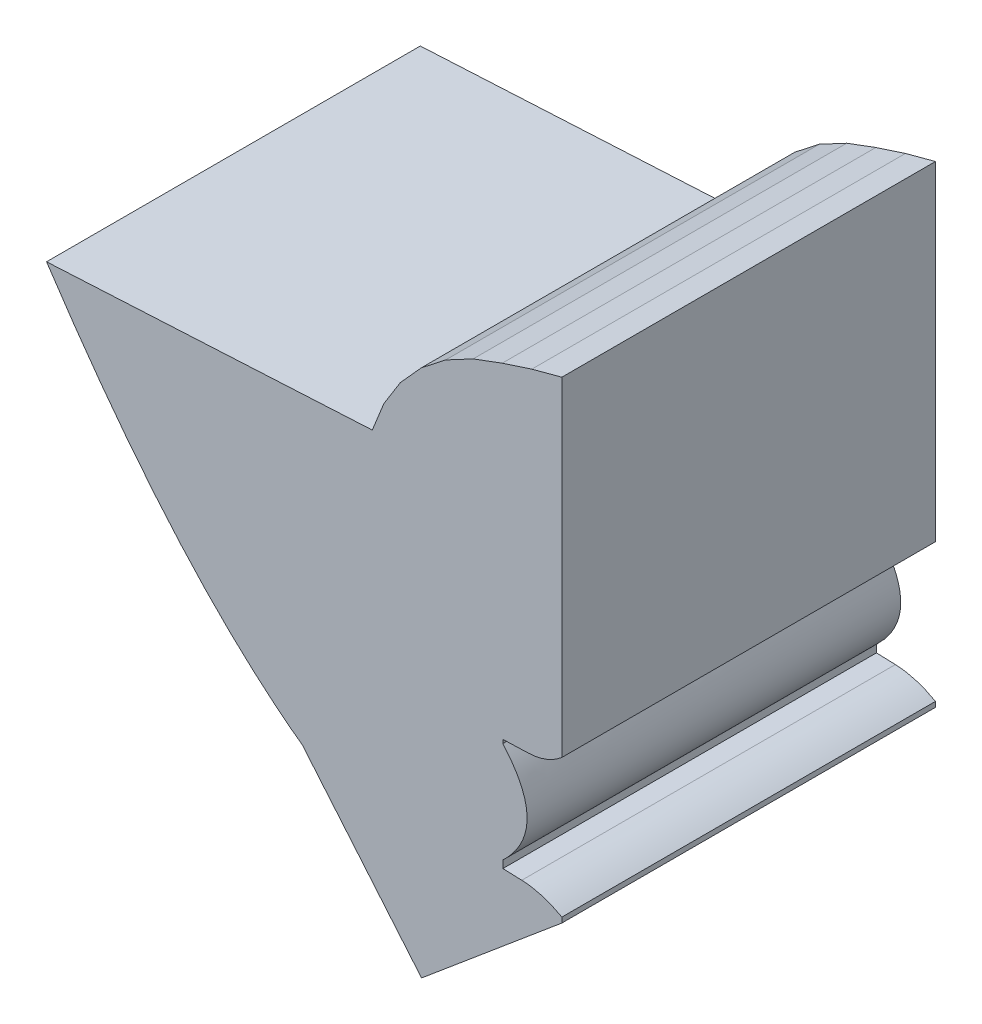
ISO-10303-21;
HEADER;
FILE_DESCRIPTION(('STEP AP214'),'2;1');
FILE_NAME('part.step','',(''),(''),'','','');
FILE_SCHEMA(('AUTOMOTIVE_DESIGN { 1 0 10303 214 1 1 1 1 }'));
ENDSEC;
DATA;
#1=APPLICATION_CONTEXT('core data for automotive mechanical design processes');
#2=APPLICATION_PROTOCOL_DEFINITION('international standard','automotive_design',2000,#1);
#3=PRODUCT_CONTEXT('',#1,'mechanical');
#4=PRODUCT('Part','Part','',(#3));
#5=PRODUCT_RELATED_PRODUCT_CATEGORY('part','',(#4));
#6=PRODUCT_DEFINITION_FORMATION('','',#4);
#7=PRODUCT_DEFINITION_CONTEXT('part definition',#1,'design');
#8=PRODUCT_DEFINITION('design','',#6,#7);
#9=PRODUCT_DEFINITION_SHAPE('','',#8);
#10=(LENGTH_UNIT() NAMED_UNIT(*) SI_UNIT(.MILLI.,.METRE.));
#11=(NAMED_UNIT(*) PLANE_ANGLE_UNIT() SI_UNIT($,.RADIAN.));
#12=(NAMED_UNIT(*) SI_UNIT($,.STERADIAN.) SOLID_ANGLE_UNIT());
#13=UNCERTAINTY_MEASURE_WITH_UNIT(LENGTH_MEASURE(1.E-05),#10,'distance_accuracy_value','');
#14=(GEOMETRIC_REPRESENTATION_CONTEXT(3) GLOBAL_UNCERTAINTY_ASSIGNED_CONTEXT((#13)) GLOBAL_UNIT_ASSIGNED_CONTEXT((#10,
#11,#12)) REPRESENTATION_CONTEXT('',''));
#15=CARTESIAN_POINT('',(0.,0.,0.));
#16=DIRECTION('',(0.,0.,1.));
#17=DIRECTION('',(1.,0.,0.));
#18=AXIS2_PLACEMENT_3D('',#15,#16,#17);
#19=CARTESIAN_POINT('',(-2.17733041778456,0.,7.21));
#20=DIRECTION('',(1.,0.,0.));
#21=DIRECTION('',(0.,1.,0.));
#22=AXIS2_PLACEMENT_3D('',#19,#20,#21);
#23=PLANE('',#22);
#24=DIRECTION('',(0.,1.,0.));
#25=VECTOR('',#24,1.);
#26=CARTESIAN_POINT('',(-2.17733041778456,0.,7.21));
#27=LINE('',#26,#25);
#28=CARTESIAN_POINT('',(-2.17733041779455,-1.68817652024789,7.21));
#29=VERTEX_POINT('',#28);
#30=CARTESIAN_POINT('',(-2.17733041778456,-1.97588987280662,7.21));
#31=VERTEX_POINT('',#30);
#32=EDGE_CURVE('E389',#29,#31,#27,.F.);
#33=ORIENTED_EDGE('',*,*,#32,.T.);
#34=DIRECTION('',(0.,0.,-1.));
#35=VECTOR('',#34,1.);
#36=CARTESIAN_POINT('',(-2.17733041778456,-1.97588987280662,7.21));
#37=LINE('',#36,#35);
#38=CARTESIAN_POINT('',(-2.17733041778456,-1.97588987280662,-7.21));
#39=VERTEX_POINT('',#38);
#40=EDGE_CURVE('E254',#31,#39,#37,.T.);
#41=ORIENTED_EDGE('',*,*,#40,.T.);
#42=DIRECTION('',(0.,1.,0.));
#43=VECTOR('',#42,1.);
#44=CARTESIAN_POINT('',(-2.17733041778456,0.,-7.21));
#45=LINE('',#44,#43);
#46=CARTESIAN_POINT('',(-2.17733041778456,-1.68817652020115,-7.21));
#47=VERTEX_POINT('',#46);
#48=EDGE_CURVE('E223',#47,#39,#45,.F.);
#49=ORIENTED_EDGE('',*,*,#48,.F.);
#50=DIRECTION('',(0.,0.,-1.));
#51=VECTOR('',#50,1.);
#52=CARTESIAN_POINT('',(-2.17733041778328,-1.68817652023794,30.8299178698776));
#53=LINE('',#52,#51);
#54=EDGE_CURVE('E536',#29,#47,#53,.T.);
#55=ORIENTED_EDGE('',*,*,#54,.F.);
#56=EDGE_LOOP('',(#33,#41,#49,#55));
#57=FACE_BOUND('',#56,.T.);
#58=ADVANCED_FACE('F60',(#57),#23,.T.);
#59=CARTESIAN_POINT('',(-82931.1005830976,996560.072871644,30.8299178698776));
#60=CARTESIAN_POINT('',(87153.8887538027,-996199.093812144,30.8299178698776));
#61=CARTESIAN_POINT('',(-91384.0928999308,995820.531871049,30.8299178698776));
#62=B_SPLINE_CURVE_WITH_KNOTS('',2,(#59,#60,#61),.UNSPECIFIED.,.F.,.F.,(3,3),(0.,1.),.UNSPECIFIED.);
#63=DIRECTION('',(0.,0.,-1.));
#64=VECTOR('',#63,1.);
#65=SURFACE_OF_LINEAR_EXTRUSION('',#62,#64);
#66=CARTESIAN_POINT('',(-10.3360060158828,-1.39847805227993,-7.21));
#67=CARTESIAN_POINT('',(-10.130177766231,-1.55526013157404,-7.21));
#68=CARTESIAN_POINT('',(-9.92505889684447,-1.70393395733359,-7.21));
#69=B_SPLINE_CURVE_WITH_KNOTS('',2,(#66,#67,#68),.UNSPECIFIED.,.F.,.F.,(3,3),(0.500919916171428,
0.500965025000237),.UNSPECIFIED.);
#70=CARTESIAN_POINT('',(-10.3360060158632,-1.39847805228234,-7.2125366176972));
#71=VERTEX_POINT('',#70);
#72=CARTESIAN_POINT('',(-9.92505889684279,-1.70393395733127,-7.21));
#73=VERTEX_POINT('',#72);
#74=EDGE_CURVE('E70',#71,#73,#69,.T.);
#75=ORIENTED_EDGE('',*,*,#74,.T.);
#76=CARTESIAN_POINT('',(-9.92303039020492,-1.70540406952979,-7.21));
#77=DIRECTION('',(0.,0.,1.));
#78=VECTOR('',#77,1.);
#79=LINE('',#76,#78);
#80=CARTESIAN_POINT('',(-9.92505890740054,-1.70393394968835,7.21));
#81=VERTEX_POINT('',#80);
#82=EDGE_CURVE('E13',#73,#81,#79,.T.);
#83=ORIENTED_EDGE('',*,*,#82,.T.);
#84=CARTESIAN_POINT('',(-9.92505890739492,-1.70393394968327,7.21));
#85=CARTESIAN_POINT('',(-10.1301777715226,-1.55526012754011,7.21));
#86=CARTESIAN_POINT('',(-10.336006015879,-1.3984780522796,7.20999999999999));
#87=B_SPLINE_CURVE_WITH_KNOTS('',2,(#84,#85,#86),.UNSPECIFIED.,.F.,.F.,(3,3),(0.500919916172588,
0.500965025000236),.UNSPECIFIED.);
#88=CARTESIAN_POINT('',(-10.3360060158816,-1.39847805227263,7.21251805157951));
#89=VERTEX_POINT('',#88);
#90=EDGE_CURVE('E381',#89,#81,#87,.F.);
#91=ORIENTED_EDGE('',*,*,#90,.F.);
#92=CARTESIAN_POINT('',(-10.336006015861,-1.39847805228632,7.21));
#93=CARTESIAN_POINT('',(-10.6228848167366,-1.17995870432205,7.21));
#94=CARTESIAN_POINT('',(-10.9111416710362,-0.945688133646021,7.21));
#95=B_SPLINE_CURVE_WITH_KNOTS('',2,(#92,#93,#94),.UNSPECIFIED.,.F.,.F.,(3,3),(0.500965025000234,
0.501027896674745),.UNSPECIFIED.);
#96=CARTESIAN_POINT('',(-10.9111416711035,-0.945688133586594,7.21251805157951));
#97=VERTEX_POINT('',#96);
#98=EDGE_CURVE('E373',#97,#89,#95,.F.);
#99=ORIENTED_EDGE('',*,*,#98,.F.);
#100=CARTESIAN_POINT('',(-10.9111416711694,-0.945688133531575,7.21));
#101=CARTESIAN_POINT('',(-15.1971813204195,2.53763911301365,7.21));
#102=CARTESIAN_POINT('',(-19.7878835648669,9.50327575735757,7.21));
#103=B_SPLINE_CURVE_WITH_KNOTS('',2,(#100,#101,#102),.UNSPECIFIED.,.F.,.F.,(3,3),
(0.501027896674761,0.501962724366634),.UNSPECIFIED.);
#104=CARTESIAN_POINT('',(-19.7878835648708,9.50327575735899,7.21251805157951));
#105=VERTEX_POINT('',#104);
#106=EDGE_CURVE('E396',#105,#97,#103,.F.);
#107=ORIENTED_EDGE('',*,*,#106,.F.);
#108=DIRECTION('',(0.,0.,1.));
#109=VECTOR('',#108,1.);
#110=CARTESIAN_POINT('',(-19.7878835648708,9.50327575735899,-7.21507323539439));
#111=LINE('',#110,#109);
#112=CARTESIAN_POINT('',(-19.7878835648708,9.50327575735899,-7.21253661769719));
#113=VERTEX_POINT('',#112);
#114=EDGE_CURVE('E305',#113,#105,#111,.T.);
#115=ORIENTED_EDGE('',*,*,#114,.F.);
#116=CARTESIAN_POINT('',(-19.7878835648714,9.50327575734023,-7.21));
#117=CARTESIAN_POINT('',(-15.197181319061,2.53763911092818,-7.21));
#118=CARTESIAN_POINT('',(-10.9111416686287,-0.945688135617351,-7.21));
#119=B_SPLINE_CURVE_WITH_KNOTS('',2,(#116,#117,#118),.UNSPECIFIED.,.F.,.F.,(3,3),
(0.501027896674483,0.501962724366634),.UNSPECIFIED.);
#120=CARTESIAN_POINT('',(-10.9111416684846,-0.945688135711886,-7.21253661769719));
#121=VERTEX_POINT('',#120);
#122=EDGE_CURVE('E308',#113,#121,#119,.T.);
#123=ORIENTED_EDGE('',*,*,#122,.T.);
#124=CARTESIAN_POINT('',(-10.9111416684921,-0.945688135713634,-7.21));
#125=CARTESIAN_POINT('',(-10.6228848154707,-1.17995870528634,-7.21));
#126=CARTESIAN_POINT('',(-10.336006015861,-1.39847805228632,-7.21));
#127=B_SPLINE_CURVE_WITH_KNOTS('',2,(#124,#125,#126),.UNSPECIFIED.,.F.,.F.,(3,3),
(0.500965025000234,0.501027896674468),.UNSPECIFIED.);
#128=EDGE_CURVE('E546',#121,#71,#127,.T.);
#129=ORIENTED_EDGE('',*,*,#128,.T.);
#130=EDGE_LOOP('',(#75,#83,#91,#99,#107,#115,#123,#129));
#131=FACE_BOUND('',#130,.T.);
#132=ADVANCED_FACE('F322',(#131),#65,.T.);
#133=DIRECTION('',(0.,1.,0.));
#134=VECTOR('',#133,1.);
#135=CARTESIAN_POINT('',(-2.17733041778456,0.,-7.21));
#136=LINE('',#135,#134);
#137=CARTESIAN_POINT('',(-2.17733041778456,2.34248700715526,-7.21));
#138=VERTEX_POINT('',#137);
#139=CARTESIAN_POINT('',(-2.17733041777607,2.20172974209443,-7.21));
#140=VERTEX_POINT('',#139);
#141=EDGE_CURVE('E362',#138,#140,#136,.F.);
#142=ORIENTED_EDGE('',*,*,#141,.F.);
#143=DIRECTION('',(0.,0.,-1.));
#144=VECTOR('',#143,1.);
#145=CARTESIAN_POINT('',(-2.17733041778456,2.34248700715526,24.0565253000013));
#146=LINE('',#145,#144);
#147=CARTESIAN_POINT('',(-2.17733041778456,2.34248700715526,7.21));
#148=VERTEX_POINT('',#147);
#149=EDGE_CURVE('E418',#148,#138,#146,.T.);
#150=ORIENTED_EDGE('',*,*,#149,.F.);
#151=DIRECTION('',(0.,1.,0.));
#152=VECTOR('',#151,1.);
#153=CARTESIAN_POINT('',(-2.17733041778456,0.,7.21));
#154=LINE('',#153,#152);
#155=CARTESIAN_POINT('',(-2.17733041778074,2.20172974210003,7.21));
#156=VERTEX_POINT('',#155);
#157=EDGE_CURVE('E372',#148,#156,#154,.F.);
#158=ORIENTED_EDGE('',*,*,#157,.T.);
#159=DIRECTION('',(0.,0.,-1.));
#160=VECTOR('',#159,1.);
#161=CARTESIAN_POINT('',(-2.17733041778074,2.20172974210003,30.8299178698776));
#162=LINE('',#161,#160);
#163=EDGE_CURVE('E532',#156,#140,#162,.T.);
#164=ORIENTED_EDGE('',*,*,#163,.T.);
#165=EDGE_LOOP('',(#142,#150,#158,#164));
#166=FACE_BOUND('',#165,.T.);
#167=ADVANCED_FACE('F330',(#166),#23,.T.);
#168=CARTESIAN_POINT('',(0.,0.,7.21));
#169=DIRECTION('',(0.,0.,1.));
#170=DIRECTION('',(1.,0.,0.));
#171=AXIS2_PLACEMENT_3D('',#168,#169,#170);
#172=PLANE('',#171);
#173=ORIENTED_EDGE('',*,*,#90,.T.);
#174=DIRECTION('',(0.642787609686544,-0.766044443118975,0.));
#175=VECTOR('',#174,1.);
#176=CARTESIAN_POINT('',(-9.92906628699395,-1.70519329135708,7.21));
#177=LINE('',#176,#175);
#178=CARTESIAN_POINT('',(-5.31573259697203,-7.20315029027654,7.21));
#179=VERTEX_POINT('',#178);
#180=EDGE_CURVE('E73',#81,#179,#177,.T.);
#181=ORIENTED_EDGE('',*,*,#180,.T.);
#182=DIRECTION('',(0.766044443120674,0.642787609684519,0.));
#183=VECTOR('',#182,1.);
#184=CARTESIAN_POINT('',(0.100000000004221,-2.65881106562334,7.21));
#185=LINE('',#184,#183);
#186=CARTESIAN_POINT('',(0.100000000004221,-2.65881106562334,7.21));
#187=VERTEX_POINT('',#186);
#188=EDGE_CURVE('E249',#179,#187,#185,.T.);
#189=ORIENTED_EDGE('',*,*,#188,.T.);
#190=DIRECTION('',(-1.62011653008151E-11,1.,0.));
#191=VECTOR('',#190,1.);
#192=CARTESIAN_POINT('',(0.100000000000981,-2.45881106562334,7.21));
#193=LINE('',#192,#191);
#194=CARTESIAN_POINT('',(0.100000000000981,-2.45881106562334,7.21));
#195=VERTEX_POINT('',#194);
#196=EDGE_CURVE('E258',#187,#195,#193,.T.);
#197=ORIENTED_EDGE('',*,*,#196,.T.);
#198=CARTESIAN_POINT('',(-15004.7897636461,-999892.444646946,7.21));
#199=CARTESIAN_POINT('',(17450.906437277,999845.695156391,7.21));
#200=CARTESIAN_POINT('',(-19903.023110908,-999806.945665836,7.21));
#201=B_SPLINE_CURVE_WITH_KNOTS('',2,(#198,#199,#200),.UNSPECIFIED.,.F.,.F.,(3,3),(0.,1.),.UNSPECIFIED.);
#202=CARTESIAN_POINT('',(-1.44765075676889,-2.00137084805176,7.21));
#203=VERTEX_POINT('',#202);
#204=EDGE_CURVE('E253',#195,#203,#201,.T.);
#205=ORIENTED_EDGE('',*,*,#204,.T.);
#206=DIRECTION('',(-0.999390827019096,0.0348994967024967,0.));
#207=VECTOR('',#206,1.);
#208=CARTESIAN_POINT('',(-1.44765075676889,-2.00137084805176,7.21));
#209=LINE('',#208,#207);
#210=EDGE_CURVE('E235',#203,#31,#209,.T.);
#211=ORIENTED_EDGE('',*,*,#210,.T.);
#212=ORIENTED_EDGE('',*,*,#32,.F.);
#213=CARTESIAN_POINT('',(-2.17733041777607,2.20172974209443,7.21));
#214=CARTESIAN_POINT('',(-0.307419303310444,0.0931805865995528,7.21));
#215=CARTESIAN_POINT('',(-2.17733041779435,-1.68817652026,7.21));
#216=B_SPLINE_CURVE_WITH_KNOTS('',2,(#213,#214,#215),.UNSPECIFIED.,.F.,.F.,(3,3),
(0.49947186766891,0.500440643667569),.UNSPECIFIED.);
#217=EDGE_CURVE('E534',#156,#29,#216,.T.);
#218=ORIENTED_EDGE('',*,*,#217,.F.);
#219=ORIENTED_EDGE('',*,*,#157,.F.);
#220=DIRECTION('',(0.999390827019096,0.0348994967025048,0.));
#221=VECTOR('',#220,1.);
#222=CARTESIAN_POINT('',(-2.17733041778456,2.34248700715526,7.21));
#223=LINE('',#222,#221);
#224=CARTESIAN_POINT('',(-1.19050164048462,2.37694782742692,7.21000000000002));
#225=VERTEX_POINT('',#224);
#226=EDGE_CURVE('E81',#148,#225,#223,.T.);
#227=ORIENTED_EDGE('',*,*,#226,.T.);
#228=CARTESIAN_POINT('',(-343900.072311573,939011.080499257,7.21000000000001));
#229=CARTESIAN_POINT('',(342019.599581338,-939690.120785908,7.21000000000001));
#230=CARTESIAN_POINT('',(-340141.301828429,940379.16107256,7.21000000000001));
#231=B_SPLINE_CURVE_WITH_KNOTS('',2,(#228,#229,#230),.UNSPECIFIED.,.F.,.F.,(3,3),(0.,1.),.UNSPECIFIED.);
#232=CARTESIAN_POINT('',(0.100000000004221,2.87767341815847,7.21000000000001));
#233=VERTEX_POINT('',#232);
#234=EDGE_CURVE('E383',#225,#233,#231,.T.);
#235=ORIENTED_EDGE('',*,*,#234,.T.);
#236=DIRECTION('',(0.,1.,0.));
#237=VECTOR('',#236,1.);
#238=CARTESIAN_POINT('',(0.100000000004221,2.87767341815847,7.21));
#239=LINE('',#238,#237);
#240=CARTESIAN_POINT('',(0.100000000004747,15.587903347272,7.21));
#241=VERTEX_POINT('',#240);
#242=EDGE_CURVE('E426',#233,#241,#239,.T.);
#243=ORIENTED_EDGE('',*,*,#242,.T.);
#244=DIRECTION('',(-0.96592582628907,-0.258819045102515,0.));
#245=VECTOR('',#244,1.);
#246=CARTESIAN_POINT('',(-1.05911099154214,15.277320493149,7.21));
#247=LINE('',#246,#245);
#248=CARTESIAN_POINT('',(-1.05911099154214,15.277320493149,7.21000000000001));
#249=VERTEX_POINT('',#248);
#250=EDGE_CURVE('E433',#241,#249,#247,.T.);
#251=ORIENTED_EDGE('',*,*,#250,.T.);
#252=DIRECTION('',(-0.951056516295155,-0.309016994374943,0.));
#253=VECTOR('',#252,1.);
#254=CARTESIAN_POINT('',(-2.20037881109632,14.906500099899,7.21));
#255=LINE('',#254,#253);
#256=CARTESIAN_POINT('',(-2.20037881109632,14.906500099899,7.21000000000001));
#257=VERTEX_POINT('',#256);
#258=EDGE_CURVE('E440',#249,#257,#255,.T.);
#259=ORIENTED_EDGE('',*,*,#258,.T.);
#260=DIRECTION('',(-0.9366721892484,-0.350207381259461,0.));
#261=VECTOR('',#260,1.);
#262=CARTESIAN_POINT('',(-3.3243854381944,14.4862512423877,7.21));
#263=LINE('',#262,#261);
#264=CARTESIAN_POINT('',(-3.3243854381944,14.4862512423877,7.21000000000001));
#265=VERTEX_POINT('',#264);
#266=EDGE_CURVE('E509',#257,#265,#263,.T.);
#267=ORIENTED_EDGE('',*,*,#266,.T.);
#268=DIRECTION('',(-0.882947592859007,-0.46947156278574,0.));
#269=VECTOR('',#268,1.);
#270=CARTESIAN_POINT('',(-4.38392254962521,13.9228853670448,7.21));
#271=LINE('',#270,#269);
#272=CARTESIAN_POINT('',(-4.38392254962521,13.9228853670448,7.21000000000001));
#273=VERTEX_POINT('',#272);
#274=EDGE_CURVE('E510',#265,#273,#271,.T.);
#275=ORIENTED_EDGE('',*,*,#274,.T.);
#276=DIRECTION('',(-0.788010753606726,-0.615661475325654,0.));
#277=VECTOR('',#276,1.);
#278=CARTESIAN_POINT('',(-5.32953545395328,13.184091596654,7.21));
#279=LINE('',#278,#277);
#280=CARTESIAN_POINT('',(-5.32953545395328,13.184091596654,7.21000000000001));
#281=VERTEX_POINT('',#280);
#282=EDGE_CURVE('E502',#273,#281,#279,.T.);
#283=ORIENTED_EDGE('',*,*,#282,.T.);
#284=DIRECTION('',(-0.669130606358526,-0.743144825477694,0.));
#285=VECTOR('',#284,1.);
#286=CARTESIAN_POINT('',(-6.13249218158351,12.2923178060808,7.21));
#287=LINE('',#286,#285);
#288=CARTESIAN_POINT('',(-6.13249218158351,12.2923178060808,7.21000000000001));
#289=VERTEX_POINT('',#288);
#290=EDGE_CURVE('E505',#281,#289,#287,.T.);
#291=ORIENTED_EDGE('',*,*,#290,.T.);
#292=DIRECTION('',(-0.52991926423321,-0.848048096156423,0.));
#293=VECTOR('',#292,1.);
#294=CARTESIAN_POINT('',(-6.76839529866336,11.2746600906931,7.21));
#295=LINE('',#294,#293);
#296=CARTESIAN_POINT('',(-6.76839529866336,11.2746600906931,7.21000000000001));
#297=VERTEX_POINT('',#296);
#298=EDGE_CURVE('E458',#289,#297,#295,.T.);
#299=ORIENTED_EDGE('',*,*,#298,.T.);
#300=DIRECTION('',(-0.374606593415918,-0.927183854566785,0.));
#301=VECTOR('',#300,1.);
#302=CARTESIAN_POINT('',(-7.21792321076246,10.1620394652129,7.21));
#303=LINE('',#302,#301);
#304=CARTESIAN_POINT('',(-7.21792321076246,10.1620394652129,7.21000000000001));
#305=VERTEX_POINT('',#304);
#306=EDGE_CURVE('E407',#297,#305,#303,.T.);
#307=ORIENTED_EDGE('',*,*,#306,.T.);
#308=DIRECTION('',(-0.998629534754494,-0.0523359562444688,0.));
#309=VECTOR('',#308,1.);
#310=CARTESIAN_POINT('',(-10.3098203952063,10.,7.21));
#311=LINE('',#310,#309);
#312=EDGE_CURVE('E382',#305,#105,#311,.T.);
#313=ORIENTED_EDGE('',*,*,#312,.T.);
#314=ORIENTED_EDGE('',*,*,#106,.T.);
#315=ORIENTED_EDGE('',*,*,#98,.T.);
#316=EDGE_LOOP('',(#173,#181,#189,#197,#205,#211,#212,#218,#219,#227,#235,#243,#251,#259,#267,
#275,#283,#291,#299,#307,#313,#314,#315));
#317=FACE_BOUND('',#316,.T.);
#318=ADVANCED_FACE('F403',(#317),#172,.T.);
#319=CARTESIAN_POINT('',(0.,0.,-7.21));
#320=DIRECTION('',(0.,0.,1.));
#321=DIRECTION('',(1.,0.,0.));
#322=AXIS2_PLACEMENT_3D('',#319,#320,#321);
#323=PLANE('',#322);
#324=ORIENTED_EDGE('',*,*,#48,.T.);
#325=DIRECTION('',(0.999390827019096,-0.0348994967024967,0.));
#326=VECTOR('',#325,1.);
#327=CARTESIAN_POINT('',(-1.44765075676889,-2.00137084805176,-7.21));
#328=LINE('',#327,#326);
#329=CARTESIAN_POINT('',(-1.44765075676889,-2.00137084805176,-7.21));
#330=VERTEX_POINT('',#329);
#331=EDGE_CURVE('E215',#39,#330,#328,.T.);
#332=ORIENTED_EDGE('',*,*,#331,.T.);
#333=CARTESIAN_POINT('',(-15004.7897636461,-999892.444646946,-7.21));
#334=CARTESIAN_POINT('',(17450.906437277,999845.695156391,-7.21));
#335=CARTESIAN_POINT('',(-19903.023110908,-999806.945665836,-7.21));
#336=B_SPLINE_CURVE_WITH_KNOTS('',2,(#333,#334,#335),.UNSPECIFIED.,.F.,.F.,(3,3),(0.,1.),.UNSPECIFIED.);
#337=CARTESIAN_POINT('',(0.100000000000981,-2.45881106562334,-7.21));
#338=VERTEX_POINT('',#337);
#339=EDGE_CURVE('E219',#330,#338,#336,.F.);
#340=ORIENTED_EDGE('',*,*,#339,.T.);
#341=DIRECTION('',(1.62011653008151E-11,-1.,0.));
#342=VECTOR('',#341,1.);
#343=CARTESIAN_POINT('',(0.100000000000981,-2.45881106562334,-7.21));
#344=LINE('',#343,#342);
#345=CARTESIAN_POINT('',(0.100000000004221,-2.65881106562334,-7.21));
#346=VERTEX_POINT('',#345);
#347=EDGE_CURVE('E237',#338,#346,#344,.T.);
#348=ORIENTED_EDGE('',*,*,#347,.T.);
#349=DIRECTION('',(-0.766044443120674,-0.642787609684519,0.));
#350=VECTOR('',#349,1.);
#351=CARTESIAN_POINT('',(0.100000000004221,-2.65881106562334,-7.21));
#352=LINE('',#351,#350);
#353=CARTESIAN_POINT('',(-5.31573259697203,-7.20315029027654,-7.21));
#354=VERTEX_POINT('',#353);
#355=EDGE_CURVE('E241',#346,#354,#352,.T.);
#356=ORIENTED_EDGE('',*,*,#355,.T.);
#357=DIRECTION('',(-0.642787609686544,0.766044443118975,0.));
#358=VECTOR('',#357,1.);
#359=CARTESIAN_POINT('',(-9.92906628699395,-1.70519329135708,-7.21));
#360=LINE('',#359,#358);
#361=EDGE_CURVE('E271',#354,#73,#360,.T.);
#362=ORIENTED_EDGE('',*,*,#361,.T.);
#363=ORIENTED_EDGE('',*,*,#74,.F.);
#364=ORIENTED_EDGE('',*,*,#128,.F.);
#365=ORIENTED_EDGE('',*,*,#122,.F.);
#366=DIRECTION('',(-0.998629534754494,-0.0523359562444688,0.));
#367=VECTOR('',#366,1.);
#368=CARTESIAN_POINT('',(-0.550881453784725,10.5114443180936,-7.21));
#369=LINE('',#368,#367);
#370=CARTESIAN_POINT('',(-7.21792321076246,10.1620394652129,-7.21));
#371=VERTEX_POINT('',#370);
#372=EDGE_CURVE('E405',#371,#113,#369,.T.);
#373=ORIENTED_EDGE('',*,*,#372,.F.);
#374=DIRECTION('',(0.374606593415918,0.927183854566785,0.));
#375=VECTOR('',#374,1.);
#376=CARTESIAN_POINT('',(-7.21792321076246,10.1620394652129,-7.21));
#377=LINE('',#376,#375);
#378=CARTESIAN_POINT('',(-6.76839529866336,11.2746600906931,-7.21));
#379=VERTEX_POINT('',#378);
#380=EDGE_CURVE('E420',#371,#379,#377,.T.);
#381=ORIENTED_EDGE('',*,*,#380,.T.);
#382=DIRECTION('',(0.52991926423321,0.848048096156423,0.));
#383=VECTOR('',#382,1.);
#384=CARTESIAN_POINT('',(-6.76839529866336,11.2746600906931,-7.21));
#385=LINE('',#384,#383);
#386=CARTESIAN_POINT('',(-6.13249218158351,12.2923178060808,-7.21));
#387=VERTEX_POINT('',#386);
#388=EDGE_CURVE('E455',#379,#387,#385,.T.);
#389=ORIENTED_EDGE('',*,*,#388,.T.);
#390=DIRECTION('',(0.669130606358526,0.743144825477694,0.));
#391=VECTOR('',#390,1.);
#392=CARTESIAN_POINT('',(-6.13249218158351,12.2923178060808,-7.21));
#393=LINE('',#392,#391);
#394=CARTESIAN_POINT('',(-5.32953545395328,13.184091596654,-7.21));
#395=VERTEX_POINT('',#394);
#396=EDGE_CURVE('E462',#387,#395,#393,.T.);
#397=ORIENTED_EDGE('',*,*,#396,.T.);
#398=DIRECTION('',(0.788010753606726,0.615661475325654,0.));
#399=VECTOR('',#398,1.);
#400=CARTESIAN_POINT('',(-5.32953545395328,13.184091596654,-7.21));
#401=LINE('',#400,#399);
#402=CARTESIAN_POINT('',(-4.38392254962521,13.9228853670448,-7.21));
#403=VERTEX_POINT('',#402);
#404=EDGE_CURVE('E470',#395,#403,#401,.T.);
#405=ORIENTED_EDGE('',*,*,#404,.T.);
#406=DIRECTION('',(0.882947592859007,0.46947156278574,0.));
#407=VECTOR('',#406,1.);
#408=CARTESIAN_POINT('',(-4.38392254962521,13.9228853670448,-7.21));
#409=LINE('',#408,#407);
#410=CARTESIAN_POINT('',(-3.3243854381944,14.4862512423877,-7.21));
#411=VERTEX_POINT('',#410);
#412=EDGE_CURVE('E469',#403,#411,#409,.T.);
#413=ORIENTED_EDGE('',*,*,#412,.T.);
#414=DIRECTION('',(0.9366721892484,0.350207381259461,0.));
#415=VECTOR('',#414,1.);
#416=CARTESIAN_POINT('',(-3.3243854381944,14.4862512423877,-7.21));
#417=LINE('',#416,#415);
#418=CARTESIAN_POINT('',(-2.20037881109632,14.906500099899,-7.21000000000001));
#419=VERTEX_POINT('',#418);
#420=EDGE_CURVE('E641',#411,#419,#417,.T.);
#421=ORIENTED_EDGE('',*,*,#420,.T.);
#422=DIRECTION('',(0.951056516295155,0.309016994374943,0.));
#423=VECTOR('',#422,1.);
#424=CARTESIAN_POINT('',(-2.20037881109632,14.906500099899,-7.21));
#425=LINE('',#424,#423);
#426=CARTESIAN_POINT('',(-1.05911099154214,15.277320493149,-7.21));
#427=VERTEX_POINT('',#426);
#428=EDGE_CURVE('E489',#419,#427,#425,.T.);
#429=ORIENTED_EDGE('',*,*,#428,.T.);
#430=DIRECTION('',(0.96592582628907,0.258819045102515,0.));
#431=VECTOR('',#430,1.);
#432=CARTESIAN_POINT('',(-1.05911099154214,15.277320493149,-7.21));
#433=LINE('',#432,#431);
#434=CARTESIAN_POINT('',(0.100000000004747,15.587903347272,-7.21));
#435=VERTEX_POINT('',#434);
#436=EDGE_CURVE('E487',#427,#435,#433,.T.);
#437=ORIENTED_EDGE('',*,*,#436,.T.);
#438=DIRECTION('',(0.,-1.,0.));
#439=VECTOR('',#438,1.);
#440=CARTESIAN_POINT('',(0.100000000004221,2.87767341815847,-7.21));
#441=LINE('',#440,#439);
#442=CARTESIAN_POINT('',(0.0999999999995449,2.8776734181557,-7.21000000000001));
#443=VERTEX_POINT('',#442);
#444=EDGE_CURVE('E485',#435,#443,#441,.T.);
#445=ORIENTED_EDGE('',*,*,#444,.T.);
#446=CARTESIAN_POINT('',(-343900.072311573,939011.080499257,-7.21000000000001));
#447=CARTESIAN_POINT('',(342019.599581338,-939690.120785908,-7.21000000000001));
#448=CARTESIAN_POINT('',(-340141.301828429,940379.16107256,-7.21000000000001));
#449=B_SPLINE_CURVE_WITH_KNOTS('',2,(#446,#447,#448),.UNSPECIFIED.,.F.,.F.,(3,3),(0.,1.),.UNSPECIFIED.);
#450=CARTESIAN_POINT('',(-1.19050164048462,2.37694782741517,-7.21));
#451=VERTEX_POINT('',#450);
#452=EDGE_CURVE('E480',#443,#451,#449,.F.);
#453=ORIENTED_EDGE('',*,*,#452,.T.);
#454=DIRECTION('',(-0.999390827019096,-0.0348994967025048,0.));
#455=VECTOR('',#454,1.);
#456=CARTESIAN_POINT('',(-2.17733041778456,2.34248700715526,-7.21));
#457=LINE('',#456,#455);
#458=EDGE_CURVE('E473',#451,#138,#457,.T.);
#459=ORIENTED_EDGE('',*,*,#458,.T.);
#460=ORIENTED_EDGE('',*,*,#141,.T.);
#461=CARTESIAN_POINT('',(-2.17733041776379,-1.68817652023098,-7.21));
#462=CARTESIAN_POINT('',(-0.307419303328964,0.0931805866132554,-7.21));
#463=CARTESIAN_POINT('',(-2.17733041776824,2.20172974208621,-7.21));
#464=B_SPLINE_CURVE_WITH_KNOTS('',2,(#461,#462,#463),.UNSPECIFIED.,.F.,.F.,(3,3),
(0.499471867668912,0.500440643667561),.UNSPECIFIED.);
#465=EDGE_CURVE('E310',#47,#140,#464,.T.);
#466=ORIENTED_EDGE('',*,*,#465,.F.);
#467=EDGE_LOOP('',(#324,#332,#340,#348,#356,#362,#363,#364,#365,#373,#381,#389,#397,#405,#413,
#421,#429,#437,#445,#453,#459,#460,#466));
#468=FACE_BOUND('',#467,.T.);
#469=ADVANCED_FACE('F220',(#468),#323,.F.);
#470=CARTESIAN_POINT('',(-996021.636606251,89148.1321438377,30.8299178698776));
#471=CARTESIAN_POINT('',(996193.448091746,-87155.7427476542,30.8299178698776));
#472=CARTESIAN_POINT('',(-996370.259577241,85163.3533514707,30.8299178698776));
#473=B_SPLINE_CURVE_WITH_KNOTS('',2,(#470,#471,#472),.UNSPECIFIED.,.F.,.F.,(3,3),(0.,1.),.UNSPECIFIED.);
#474=DIRECTION('',(0.,0.,-1.));
#475=VECTOR('',#474,1.);
#476=SURFACE_OF_LINEAR_EXTRUSION('',#473,#475);
#477=ORIENTED_EDGE('',*,*,#163,.F.);
#478=ORIENTED_EDGE('',*,*,#217,.T.);
#479=ORIENTED_EDGE('',*,*,#54,.T.);
#480=ORIENTED_EDGE('',*,*,#465,.T.);
#481=EDGE_LOOP('',(#477,#478,#479,#480));
#482=FACE_BOUND('',#481,.T.);
#483=ADVANCED_FACE('F331',(#482),#476,.T.);
#484=CARTESIAN_POINT('',(-19.7878835648708,9.50327575735899,-7.21507323539439));
#485=DIRECTION('',(-0.0523359562444688,0.998629534754494,0.));
#486=DIRECTION('',(-0.998629534754494,-0.0523359562444688,0.));
#487=AXIS2_PLACEMENT_3D('',#484,#485,#486);
#488=PLANE('',#487);
#489=ORIENTED_EDGE('',*,*,#312,.F.);
#490=DIRECTION('',(0.,0.,-1.));
#491=VECTOR('',#490,1.);
#492=CARTESIAN_POINT('',(-7.21792321076246,10.1620394652129,24.0565253000013));
#493=LINE('',#492,#491);
#494=EDGE_CURVE('E413',#305,#371,#493,.T.);
#495=ORIENTED_EDGE('',*,*,#494,.T.);
#496=ORIENTED_EDGE('',*,*,#372,.T.);
#497=ORIENTED_EDGE('',*,*,#114,.T.);
#498=EDGE_LOOP('',(#489,#495,#496,#497));
#499=FACE_BOUND('',#498,.T.);
#500=ADVANCED_FACE('F327',(#499),#488,.T.);
#501=CARTESIAN_POINT('',(-1.05911099154214,15.277320493149,24.0565253000013));
#502=DIRECTION('',(0.258819045102515,-0.96592582628907,0.));
#503=DIRECTION('',(0.96592582628907,0.258819045102515,0.));
#504=AXIS2_PLACEMENT_3D('',#501,#502,#503);
#505=PLANE('',#504);
#506=ORIENTED_EDGE('',*,*,#250,.F.);
#507=DIRECTION('',(0.,0.,-1.));
#508=VECTOR('',#507,1.);
#509=CARTESIAN_POINT('',(0.100000000004747,15.587903347272,24.0565253000013));
#510=LINE('',#509,#508);
#511=EDGE_CURVE('E297',#241,#435,#510,.T.);
#512=ORIENTED_EDGE('',*,*,#511,.T.);
#513=ORIENTED_EDGE('',*,*,#436,.F.);
#514=DIRECTION('',(0.,0.,-1.));
#515=VECTOR('',#514,1.);
#516=CARTESIAN_POINT('',(-1.05911099154214,15.277320493149,24.0565253000013));
#517=LINE('',#516,#515);
#518=EDGE_CURVE('E441',#249,#427,#517,.T.);
#519=ORIENTED_EDGE('',*,*,#518,.F.);
#520=EDGE_LOOP('',(#506,#512,#513,#519));
#521=FACE_BOUND('',#520,.T.);
#522=ADVANCED_FACE('F523',(#521),#505,.F.);
#523=CARTESIAN_POINT('',(-2.20037881109632,14.906500099899,24.0565253000013));
#524=DIRECTION('',(0.309016994374943,-0.951056516295155,0.));
#525=DIRECTION('',(0.951056516295155,0.309016994374943,0.));
#526=AXIS2_PLACEMENT_3D('',#523,#524,#525);
#527=PLANE('',#526);
#528=ORIENTED_EDGE('',*,*,#258,.F.);
#529=ORIENTED_EDGE('',*,*,#518,.T.);
#530=ORIENTED_EDGE('',*,*,#428,.F.);
#531=DIRECTION('',(0.,0.,-1.));
#532=VECTOR('',#531,1.);
#533=CARTESIAN_POINT('',(-2.20037881109632,14.906500099899,24.0565253000013));
#534=LINE('',#533,#532);
#535=EDGE_CURVE('E442',#257,#419,#534,.T.);
#536=ORIENTED_EDGE('',*,*,#535,.F.);
#537=EDGE_LOOP('',(#528,#529,#530,#536));
#538=FACE_BOUND('',#537,.T.);
#539=ADVANCED_FACE('F517',(#538),#527,.F.);
#540=CARTESIAN_POINT('',(-3.3243854381944,14.4862512423877,24.0565253000013));
#541=DIRECTION('',(0.350207381259461,-0.9366721892484,0.));
#542=DIRECTION('',(0.9366721892484,0.350207381259461,0.));
#543=AXIS2_PLACEMENT_3D('',#540,#541,#542);
#544=PLANE('',#543);
#545=ORIENTED_EDGE('',*,*,#266,.F.);
#546=ORIENTED_EDGE('',*,*,#535,.T.);
#547=ORIENTED_EDGE('',*,*,#420,.F.);
#548=DIRECTION('',(0.,0.,-1.));
#549=VECTOR('',#548,1.);
#550=CARTESIAN_POINT('',(-3.3243854381944,14.4862512423877,24.0565253000013));
#551=LINE('',#550,#549);
#552=EDGE_CURVE('E444',#265,#411,#551,.T.);
#553=ORIENTED_EDGE('',*,*,#552,.F.);
#554=EDGE_LOOP('',(#545,#546,#547,#553));
#555=FACE_BOUND('',#554,.T.);
#556=ADVANCED_FACE('F701',(#555),#544,.F.);
#557=CARTESIAN_POINT('',(-4.38392254962521,13.9228853670448,24.0565253000013));
#558=DIRECTION('',(0.46947156278574,-0.882947592859007,0.));
#559=DIRECTION('',(0.882947592859007,0.46947156278574,0.));
#560=AXIS2_PLACEMENT_3D('',#557,#558,#559);
#561=PLANE('',#560);
#562=ORIENTED_EDGE('',*,*,#274,.F.);
#563=ORIENTED_EDGE('',*,*,#552,.T.);
#564=ORIENTED_EDGE('',*,*,#412,.F.);
#565=DIRECTION('',(0.,0.,-1.));
#566=VECTOR('',#565,1.);
#567=CARTESIAN_POINT('',(-4.38392254962521,13.9228853670448,24.0565253000013));
#568=LINE('',#567,#566);
#569=EDGE_CURVE('E450',#273,#403,#568,.T.);
#570=ORIENTED_EDGE('',*,*,#569,.F.);
#571=EDGE_LOOP('',(#562,#563,#564,#570));
#572=FACE_BOUND('',#571,.T.);
#573=ADVANCED_FACE('F706',(#572),#561,.F.);
#574=CARTESIAN_POINT('',(-5.32953545395328,13.184091596654,24.0565253000013));
#575=DIRECTION('',(0.615661475325654,-0.788010753606726,0.));
#576=DIRECTION('',(0.788010753606726,0.615661475325654,0.));
#577=AXIS2_PLACEMENT_3D('',#574,#575,#576);
#578=PLANE('',#577);
#579=ORIENTED_EDGE('',*,*,#282,.F.);
#580=ORIENTED_EDGE('',*,*,#569,.T.);
#581=ORIENTED_EDGE('',*,*,#404,.F.);
#582=DIRECTION('',(0.,0.,-1.));
#583=VECTOR('',#582,1.);
#584=CARTESIAN_POINT('',(-5.32953545395328,13.184091596654,24.0565253000013));
#585=LINE('',#584,#583);
#586=EDGE_CURVE('E446',#281,#395,#585,.T.);
#587=ORIENTED_EDGE('',*,*,#586,.F.);
#588=EDGE_LOOP('',(#579,#580,#581,#587));
#589=FACE_BOUND('',#588,.T.);
#590=ADVANCED_FACE('F716',(#589),#578,.F.);
#591=CARTESIAN_POINT('',(-6.13249218158351,12.2923178060808,24.0565253000013));
#592=DIRECTION('',(0.743144825477693,-0.669130606358526,0.));
#593=DIRECTION('',(0.669130606358526,0.743144825477694,0.));
#594=AXIS2_PLACEMENT_3D('',#591,#592,#593);
#595=PLANE('',#594);
#596=ORIENTED_EDGE('',*,*,#290,.F.);
#597=ORIENTED_EDGE('',*,*,#586,.T.);
#598=ORIENTED_EDGE('',*,*,#396,.F.);
#599=DIRECTION('',(0.,0.,-1.));
#600=VECTOR('',#599,1.);
#601=CARTESIAN_POINT('',(-6.13249218158351,12.2923178060808,24.0565253000013));
#602=LINE('',#601,#600);
#603=EDGE_CURVE('E421',#289,#387,#602,.T.);
#604=ORIENTED_EDGE('',*,*,#603,.F.);
#605=EDGE_LOOP('',(#596,#597,#598,#604));
#606=FACE_BOUND('',#605,.T.);
#607=ADVANCED_FACE('F465',(#606),#595,.F.);
#608=CARTESIAN_POINT('',(-6.76839529866336,11.2746600906931,24.0565253000013));
#609=DIRECTION('',(0.848048096156423,-0.52991926423321,0.));
#610=DIRECTION('',(0.52991926423321,0.848048096156423,0.));
#611=AXIS2_PLACEMENT_3D('',#608,#609,#610);
#612=PLANE('',#611);
#613=ORIENTED_EDGE('',*,*,#298,.F.);
#614=ORIENTED_EDGE('',*,*,#603,.T.);
#615=ORIENTED_EDGE('',*,*,#388,.F.);
#616=DIRECTION('',(0.,0.,-1.));
#617=VECTOR('',#616,1.);
#618=CARTESIAN_POINT('',(-6.76839529866336,11.2746600906931,24.0565253000013));
#619=LINE('',#618,#617);
#620=EDGE_CURVE('E417',#297,#379,#619,.T.);
#621=ORIENTED_EDGE('',*,*,#620,.F.);
#622=EDGE_LOOP('',(#613,#614,#615,#621));
#623=FACE_BOUND('',#622,.T.);
#624=ADVANCED_FACE('F453',(#623),#612,.F.);
#625=CARTESIAN_POINT('',(-7.21792321076246,10.1620394652129,24.0565253000013));
#626=DIRECTION('',(0.927183854566785,-0.374606593415918,0.));
#627=DIRECTION('',(0.374606593415918,0.927183854566785,0.));
#628=AXIS2_PLACEMENT_3D('',#625,#626,#627);
#629=PLANE('',#628);
#630=ORIENTED_EDGE('',*,*,#306,.F.);
#631=ORIENTED_EDGE('',*,*,#620,.T.);
#632=ORIENTED_EDGE('',*,*,#380,.F.);
#633=ORIENTED_EDGE('',*,*,#494,.F.);
#634=EDGE_LOOP('',(#630,#631,#632,#633));
#635=FACE_BOUND('',#634,.T.);
#636=ADVANCED_FACE('F412',(#635),#629,.F.);
#637=CARTESIAN_POINT('',(-2.17733041778456,2.34248700715526,24.0565253000013));
#638=DIRECTION('',(-0.0348994967025048,0.999390827019096,0.));
#639=DIRECTION('',(-0.999390827019096,-0.0348994967025048,0.));
#640=AXIS2_PLACEMENT_3D('',#637,#638,#639);
#641=PLANE('',#640);
#642=ORIENTED_EDGE('',*,*,#226,.F.);
#643=ORIENTED_EDGE('',*,*,#149,.T.);
#644=ORIENTED_EDGE('',*,*,#458,.F.);
#645=DIRECTION('',(0.,0.,-1.));
#646=VECTOR('',#645,1.);
#647=CARTESIAN_POINT('',(-1.19050164048462,2.37694782742692,24.0565253000013));
#648=LINE('',#647,#646);
#649=EDGE_CURVE('E423',#225,#451,#648,.T.);
#650=ORIENTED_EDGE('',*,*,#649,.F.);
#651=EDGE_LOOP('',(#642,#643,#644,#650));
#652=FACE_BOUND('',#651,.T.);
#653=ADVANCED_FACE('F292',(#652),#641,.F.);
#654=CARTESIAN_POINT('',(-343900.072311573,939011.080499257,24.0565253000013));
#655=CARTESIAN_POINT('',(342019.599581338,-939690.120785908,24.0565253000013));
#656=CARTESIAN_POINT('',(-340141.301828429,940379.16107256,24.0565253000013));
#657=B_SPLINE_CURVE_WITH_KNOTS('',2,(#654,#655,#656),.UNSPECIFIED.,.F.,.F.,(3,3),(0.,1.),.UNSPECIFIED.);
#658=DIRECTION('',(0.,0.,-1.));
#659=VECTOR('',#658,1.);
#660=SURFACE_OF_LINEAR_EXTRUSION('',#657,#659);
#661=ORIENTED_EDGE('',*,*,#234,.F.);
#662=ORIENTED_EDGE('',*,*,#649,.T.);
#663=ORIENTED_EDGE('',*,*,#452,.F.);
#664=DIRECTION('',(0.,0.,-1.));
#665=VECTOR('',#664,1.);
#666=CARTESIAN_POINT('',(0.100000000004221,2.87767341815847,24.0565253000013));
#667=LINE('',#666,#665);
#668=EDGE_CURVE('E430',#233,#443,#667,.T.);
#669=ORIENTED_EDGE('',*,*,#668,.F.);
#670=EDGE_LOOP('',(#661,#662,#663,#669));
#671=FACE_BOUND('',#670,.T.);
#672=ADVANCED_FACE('F290',(#671),#660,.F.);
#673=CARTESIAN_POINT('',(0.100000000004221,2.87767341815847,24.0565253000013));
#674=DIRECTION('',(-1.,0.,0.));
#675=DIRECTION('',(0.,-1.,0.));
#676=AXIS2_PLACEMENT_3D('',#673,#674,#675);
#677=PLANE('',#676);
#678=ORIENTED_EDGE('',*,*,#242,.F.);
#679=ORIENTED_EDGE('',*,*,#668,.T.);
#680=ORIENTED_EDGE('',*,*,#444,.F.);
#681=ORIENTED_EDGE('',*,*,#511,.F.);
#682=EDGE_LOOP('',(#678,#679,#680,#681));
#683=FACE_BOUND('',#682,.T.);
#684=ADVANCED_FACE('F282',(#683),#677,.F.);
#685=CARTESIAN_POINT('',(-1.44765075676889,-2.00137084805176,18.6472069033908));
#686=DIRECTION('',(-0.0348994967024967,-0.999390827019096,0.));
#687=DIRECTION('',(0.999390827019096,-0.0348994967024967,0.));
#688=AXIS2_PLACEMENT_3D('',#685,#686,#687);
#689=PLANE('',#688);
#690=ORIENTED_EDGE('',*,*,#40,.F.);
#691=ORIENTED_EDGE('',*,*,#210,.F.);
#692=DIRECTION('',(0.,0.,-1.));
#693=VECTOR('',#692,1.);
#694=CARTESIAN_POINT('',(-1.44765075676889,-2.00137084805176,18.6472069033908));
#695=LINE('',#694,#693);
#696=EDGE_CURVE('E230',#203,#330,#695,.T.);
#697=ORIENTED_EDGE('',*,*,#696,.T.);
#698=ORIENTED_EDGE('',*,*,#331,.F.);
#699=EDGE_LOOP('',(#690,#691,#697,#698));
#700=FACE_BOUND('',#699,.T.);
#701=ADVANCED_FACE('F229',(#700),#689,.F.);
#702=CARTESIAN_POINT('',(-15004.7897636461,-999892.444646946,18.6472069033908));
#703=CARTESIAN_POINT('',(17450.906437277,999845.695156391,18.6472069033908));
#704=CARTESIAN_POINT('',(-19903.023110908,-999806.945665836,18.6472069033908));
#705=B_SPLINE_CURVE_WITH_KNOTS('',2,(#702,#703,#704),.UNSPECIFIED.,.F.,.F.,(3,3),(0.,1.),.UNSPECIFIED.);
#706=DIRECTION('',(0.,0.,-1.));
#707=VECTOR('',#706,1.);
#708=SURFACE_OF_LINEAR_EXTRUSION('',#705,#707);
#709=ORIENTED_EDGE('',*,*,#204,.F.);
#710=DIRECTION('',(0.,0.,-1.));
#711=VECTOR('',#710,1.);
#712=CARTESIAN_POINT('',(0.100000000000981,-2.45881106562334,18.6472069033908));
#713=LINE('',#712,#711);
#714=EDGE_CURVE('E228',#195,#338,#713,.T.);
#715=ORIENTED_EDGE('',*,*,#714,.T.);
#716=ORIENTED_EDGE('',*,*,#339,.F.);
#717=ORIENTED_EDGE('',*,*,#696,.F.);
#718=EDGE_LOOP('',(#709,#715,#716,#717));
#719=FACE_BOUND('',#718,.T.);
#720=ADVANCED_FACE('F238',(#719),#708,.F.);
#721=CARTESIAN_POINT('',(-9.92906628699395,-1.70519329135708,18.6472069033908));
#722=DIRECTION('',(0.766044443118975,0.642787609686544,0.));
#723=DIRECTION('',(-0.642787609686544,0.766044443118975,0.));
#724=AXIS2_PLACEMENT_3D('',#721,#722,#723);
#725=PLANE('',#724);
#726=ORIENTED_EDGE('',*,*,#180,.F.);
#727=ORIENTED_EDGE('',*,*,#82,.F.);
#728=ORIENTED_EDGE('',*,*,#361,.F.);
#729=DIRECTION('',(0.,0.,-1.));
#730=VECTOR('',#729,1.);
#731=CARTESIAN_POINT('',(-5.31573259697203,-7.20315029027654,18.6472069033908));
#732=LINE('',#731,#730);
#733=EDGE_CURVE('E236',#179,#354,#732,.T.);
#734=ORIENTED_EDGE('',*,*,#733,.F.);
#735=EDGE_LOOP('',(#726,#727,#728,#734));
#736=FACE_BOUND('',#735,.T.);
#737=ADVANCED_FACE('F285',(#736),#725,.F.);
#738=CARTESIAN_POINT('',(0.100000000004221,-2.65881106562334,18.6472069033908));
#739=DIRECTION('',(-0.642787609684519,0.766044443120674,0.));
#740=DIRECTION('',(-0.766044443120674,-0.642787609684519,0.));
#741=AXIS2_PLACEMENT_3D('',#738,#739,#740);
#742=PLANE('',#741);
#743=ORIENTED_EDGE('',*,*,#188,.F.);
#744=ORIENTED_EDGE('',*,*,#733,.T.);
#745=ORIENTED_EDGE('',*,*,#355,.F.);
#746=DIRECTION('',(0.,0.,-1.));
#747=VECTOR('',#746,1.);
#748=CARTESIAN_POINT('',(0.100000000004221,-2.65881106562334,18.6472069033908));
#749=LINE('',#748,#747);
#750=EDGE_CURVE('E262',#187,#346,#749,.T.);
#751=ORIENTED_EDGE('',*,*,#750,.F.);
#752=EDGE_LOOP('',(#743,#744,#745,#751));
#753=FACE_BOUND('',#752,.T.);
#754=ADVANCED_FACE('F665',(#753),#742,.F.);
#755=CARTESIAN_POINT('',(0.100000000000981,-2.45881106562334,18.6472069033908));
#756=DIRECTION('',(-1.,-1.62011653008151E-11,0.));
#757=DIRECTION('',(1.62011653008151E-11,-1.,0.));
#758=AXIS2_PLACEMENT_3D('',#755,#756,#757);
#759=PLANE('',#758);
#760=ORIENTED_EDGE('',*,*,#196,.F.);
#761=ORIENTED_EDGE('',*,*,#750,.T.);
#762=ORIENTED_EDGE('',*,*,#347,.F.);
#763=ORIENTED_EDGE('',*,*,#714,.F.);
#764=EDGE_LOOP('',(#760,#761,#762,#763));
#765=FACE_BOUND('',#764,.T.);
#766=ADVANCED_FACE('F663',(#765),#759,.F.);
#767=CLOSED_SHELL('',(#58,#132,#167,#318,#469,#483,#500,#522,#539,#556,#573,#590,#607,#624,#636,
#653,#672,#684,#701,#720,#737,#754,#766));
#768=MANIFOLD_SOLID_BREP('B2',#767);
#769=ADVANCED_BREP_SHAPE_REPRESENTATION('',(#18,#768),#14);
#770=SHAPE_DEFINITION_REPRESENTATION(#9,#769);
ENDSEC;
END-ISO-10303-21;
